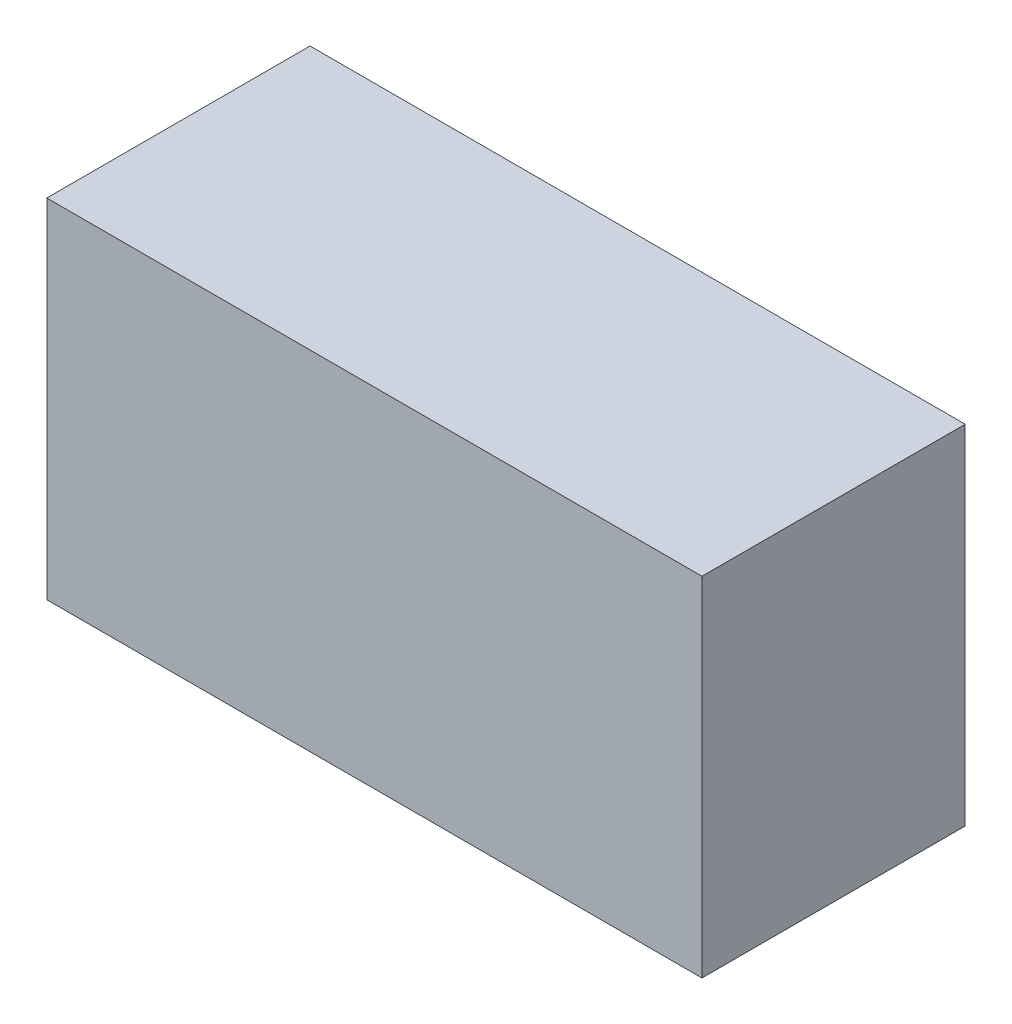
ISO-10303-21;
HEADER;
FILE_DESCRIPTION(('STEP AP214'),'2;1');
FILE_NAME('part.step','',(''),(''),'','','');
FILE_SCHEMA(('AUTOMOTIVE_DESIGN { 1 0 10303 214 1 1 1 1 }'));
ENDSEC;
DATA;
#1=APPLICATION_CONTEXT('core data for automotive mechanical design processes');
#2=APPLICATION_PROTOCOL_DEFINITION('international standard','automotive_design',2000,#1);
#3=PRODUCT_CONTEXT('',#1,'mechanical');
#4=PRODUCT('Part','Part','',(#3));
#5=PRODUCT_RELATED_PRODUCT_CATEGORY('part','',(#4));
#6=PRODUCT_DEFINITION_FORMATION('','',#4);
#7=PRODUCT_DEFINITION_CONTEXT('part definition',#1,'design');
#8=PRODUCT_DEFINITION('design','',#6,#7);
#9=PRODUCT_DEFINITION_SHAPE('','',#8);
#10=(LENGTH_UNIT() NAMED_UNIT(*) SI_UNIT(.MILLI.,.METRE.));
#11=(NAMED_UNIT(*) PLANE_ANGLE_UNIT() SI_UNIT($,.RADIAN.));
#12=(NAMED_UNIT(*) SI_UNIT($,.STERADIAN.) SOLID_ANGLE_UNIT());
#13=UNCERTAINTY_MEASURE_WITH_UNIT(LENGTH_MEASURE(1.E-05),#10,'distance_accuracy_value','');
#14=(GEOMETRIC_REPRESENTATION_CONTEXT(3) GLOBAL_UNCERTAINTY_ASSIGNED_CONTEXT((#13)) GLOBAL_UNIT_ASSIGNED_CONTEXT((#10,
#11,#12)) REPRESENTATION_CONTEXT('',''));
#15=CARTESIAN_POINT('',(0.,0.,0.));
#16=DIRECTION('',(0.,0.,1.));
#17=DIRECTION('',(1.,0.,0.));
#18=AXIS2_PLACEMENT_3D('',#15,#16,#17);
#19=CARTESIAN_POINT('',(-1.2444,-0.6608,1.));
#20=DIRECTION('',(1.,0.,0.));
#21=DIRECTION('',(0.,0.,-1.));
#22=AXIS2_PLACEMENT_3D('',#19,#20,#21);
#23=PLANE('',#22);
#24=DIRECTION('',(0.,-1.,0.));
#25=VECTOR('',#24,1.);
#26=CARTESIAN_POINT('',(-1.2444,-0.6608,0.));
#27=LINE('',#26,#25);
#28=CARTESIAN_POINT('',(-1.2444,0.6608,0.));
#29=VERTEX_POINT('',#28);
#30=CARTESIAN_POINT('',(-1.2444,-0.6608,0.));
#31=VERTEX_POINT('',#30);
#32=EDGE_CURVE('E95',#29,#31,#27,.T.);
#33=ORIENTED_EDGE('',*,*,#32,.T.);
#34=DIRECTION('',(0.,0.,-1.));
#35=VECTOR('',#34,1.);
#36=CARTESIAN_POINT('',(-1.2444,-0.6608,1.));
#37=LINE('',#36,#35);
#38=CARTESIAN_POINT('',(-1.2444,-0.6608,1.));
#39=VERTEX_POINT('',#38);
#40=EDGE_CURVE('E11',#39,#31,#37,.T.);
#41=ORIENTED_EDGE('',*,*,#40,.F.);
#42=DIRECTION('',(0.,-1.,0.));
#43=VECTOR('',#42,1.);
#44=CARTESIAN_POINT('',(-1.2444,-0.6608,1.));
#45=LINE('',#44,#43);
#46=CARTESIAN_POINT('',(-1.2444,0.6608,1.));
#47=VERTEX_POINT('',#46);
#48=EDGE_CURVE('E83',#47,#39,#45,.T.);
#49=ORIENTED_EDGE('',*,*,#48,.F.);
#50=DIRECTION('',(0.,0.,-1.));
#51=VECTOR('',#50,1.);
#52=CARTESIAN_POINT('',(-1.2444,0.6608,1.));
#53=LINE('',#52,#51);
#54=EDGE_CURVE('E91',#47,#29,#53,.T.);
#55=ORIENTED_EDGE('',*,*,#54,.T.);
#56=EDGE_LOOP('',(#33,#41,#49,#55));
#57=FACE_BOUND('',#56,.T.);
#58=ADVANCED_FACE('F32',(#57),#23,.F.);
#59=CARTESIAN_POINT('',(1.2444,-0.6608,1.));
#60=DIRECTION('',(0.,1.,0.));
#61=DIRECTION('',(0.,0.,1.));
#62=AXIS2_PLACEMENT_3D('',#59,#60,#61);
#63=PLANE('',#62);
#64=DIRECTION('',(1.,0.,0.));
#65=VECTOR('',#64,1.);
#66=CARTESIAN_POINT('',(1.2444,-0.6608,0.));
#67=LINE('',#66,#65);
#68=CARTESIAN_POINT('',(1.2444,-0.6608,0.));
#69=VERTEX_POINT('',#68);
#70=EDGE_CURVE('E87',#31,#69,#67,.T.);
#71=ORIENTED_EDGE('',*,*,#70,.T.);
#72=DIRECTION('',(0.,0.,-1.));
#73=VECTOR('',#72,1.);
#74=CARTESIAN_POINT('',(1.2444,-0.6608,1.));
#75=LINE('',#74,#73);
#76=CARTESIAN_POINT('',(1.2444,-0.6608,1.));
#77=VERTEX_POINT('',#76);
#78=EDGE_CURVE('E40',#77,#69,#75,.T.);
#79=ORIENTED_EDGE('',*,*,#78,.F.);
#80=DIRECTION('',(1.,0.,0.));
#81=VECTOR('',#80,1.);
#82=CARTESIAN_POINT('',(1.2444,-0.6608,1.));
#83=LINE('',#82,#81);
#84=EDGE_CURVE('E78',#39,#77,#83,.T.);
#85=ORIENTED_EDGE('',*,*,#84,.F.);
#86=ORIENTED_EDGE('',*,*,#40,.T.);
#87=EDGE_LOOP('',(#71,#79,#85,#86));
#88=FACE_BOUND('',#87,.T.);
#89=ADVANCED_FACE('F86',(#88),#63,.F.);
#90=CARTESIAN_POINT('',(1.2444,0.6608,1.));
#91=DIRECTION('',(-1.,0.,0.));
#92=DIRECTION('',(0.,0.,1.));
#93=AXIS2_PLACEMENT_3D('',#90,#91,#92);
#94=PLANE('',#93);
#95=DIRECTION('',(0.,1.,0.));
#96=VECTOR('',#95,1.);
#97=CARTESIAN_POINT('',(1.2444,0.6608,0.));
#98=LINE('',#97,#96);
#99=CARTESIAN_POINT('',(1.2444,0.6608,0.));
#100=VERTEX_POINT('',#99);
#101=EDGE_CURVE('E65',#69,#100,#98,.T.);
#102=ORIENTED_EDGE('',*,*,#101,.T.);
#103=DIRECTION('',(0.,0.,-1.));
#104=VECTOR('',#103,1.);
#105=CARTESIAN_POINT('',(1.2444,0.6608,1.));
#106=LINE('',#105,#104);
#107=CARTESIAN_POINT('',(1.2444,0.6608,1.));
#108=VERTEX_POINT('',#107);
#109=EDGE_CURVE('E88',#108,#100,#106,.T.);
#110=ORIENTED_EDGE('',*,*,#109,.F.);
#111=DIRECTION('',(0.,1.,0.));
#112=VECTOR('',#111,1.);
#113=CARTESIAN_POINT('',(1.2444,0.6608,1.));
#114=LINE('',#113,#112);
#115=EDGE_CURVE('E81',#77,#108,#114,.T.);
#116=ORIENTED_EDGE('',*,*,#115,.F.);
#117=ORIENTED_EDGE('',*,*,#78,.T.);
#118=EDGE_LOOP('',(#102,#110,#116,#117));
#119=FACE_BOUND('',#118,.T.);
#120=ADVANCED_FACE('F89',(#119),#94,.F.);
#121=CARTESIAN_POINT('',(-1.2444,0.6608,1.));
#122=DIRECTION('',(0.,-1.,0.));
#123=DIRECTION('',(0.,0.,-1.));
#124=AXIS2_PLACEMENT_3D('',#121,#122,#123);
#125=PLANE('',#124);
#126=DIRECTION('',(-1.,0.,0.));
#127=VECTOR('',#126,1.);
#128=CARTESIAN_POINT('',(-1.2444,0.6608,0.));
#129=LINE('',#128,#127);
#130=EDGE_CURVE('E71',#100,#29,#129,.T.);
#131=ORIENTED_EDGE('',*,*,#130,.T.);
#132=ORIENTED_EDGE('',*,*,#54,.F.);
#133=DIRECTION('',(-1.,0.,0.));
#134=VECTOR('',#133,1.);
#135=CARTESIAN_POINT('',(-1.2444,0.6608,1.));
#136=LINE('',#135,#134);
#137=EDGE_CURVE('E48',#108,#47,#136,.T.);
#138=ORIENTED_EDGE('',*,*,#137,.F.);
#139=ORIENTED_EDGE('',*,*,#109,.T.);
#140=EDGE_LOOP('',(#131,#132,#138,#139));
#141=FACE_BOUND('',#140,.T.);
#142=ADVANCED_FACE('F102',(#141),#125,.F.);
#143=CARTESIAN_POINT('',(0.,0.,1.));
#144=DIRECTION('',(0.,0.,-1.));
#145=DIRECTION('',(-1.,0.,0.));
#146=AXIS2_PLACEMENT_3D('',#143,#144,#145);
#147=PLANE('',#146);
#148=ORIENTED_EDGE('',*,*,#48,.T.);
#149=ORIENTED_EDGE('',*,*,#84,.T.);
#150=ORIENTED_EDGE('',*,*,#115,.T.);
#151=ORIENTED_EDGE('',*,*,#137,.T.);
#152=EDGE_LOOP('',(#148,#149,#150,#151));
#153=FACE_BOUND('',#152,.T.);
#154=ADVANCED_FACE('F79',(#153),#147,.F.);
#155=CARTESIAN_POINT('',(0.,0.,0.));
#156=DIRECTION('',(0.,0.,-1.));
#157=DIRECTION('',(-1.,0.,0.));
#158=AXIS2_PLACEMENT_3D('',#155,#156,#157);
#159=PLANE('',#158);
#160=ORIENTED_EDGE('',*,*,#32,.F.);
#161=ORIENTED_EDGE('',*,*,#130,.F.);
#162=ORIENTED_EDGE('',*,*,#101,.F.);
#163=ORIENTED_EDGE('',*,*,#70,.F.);
#164=EDGE_LOOP('',(#160,#161,#162,#163));
#165=FACE_BOUND('',#164,.T.);
#166=ADVANCED_FACE('F105',(#165),#159,.T.);
#167=CLOSED_SHELL('',(#58,#89,#120,#142,#154,#166));
#168=MANIFOLD_SOLID_BREP('B2',#167);
#169=ADVANCED_BREP_SHAPE_REPRESENTATION('',(#18,#168),#14);
#170=SHAPE_DEFINITION_REPRESENTATION(#9,#169);
ENDSEC;
END-ISO-10303-21;
